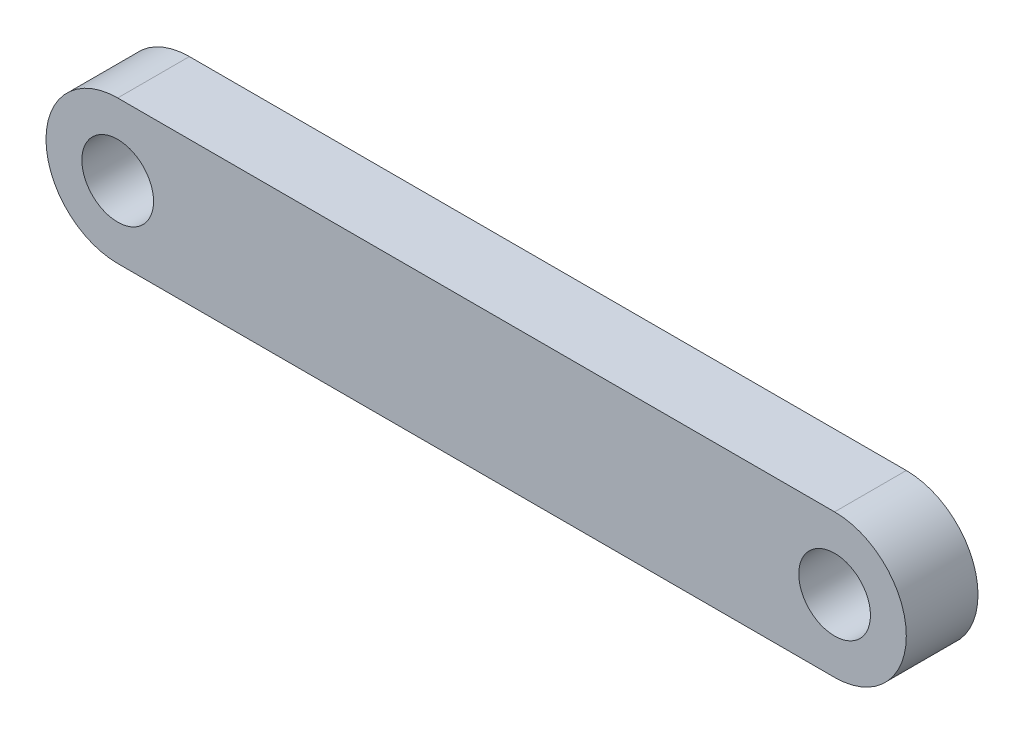
ISO-10303-21;
HEADER;
FILE_DESCRIPTION(('STEP AP214'),'2;1');
FILE_NAME('part.step','',(''),(''),'','','');
FILE_SCHEMA(('AUTOMOTIVE_DESIGN { 1 0 10303 214 1 1 1 1 }'));
ENDSEC;
DATA;
#1=APPLICATION_CONTEXT('core data for automotive mechanical design processes');
#2=APPLICATION_PROTOCOL_DEFINITION('international standard','automotive_design',2000,#1);
#3=PRODUCT_CONTEXT('',#1,'mechanical');
#4=PRODUCT('Part','Part','',(#3));
#5=PRODUCT_RELATED_PRODUCT_CATEGORY('part','',(#4));
#6=PRODUCT_DEFINITION_FORMATION('','',#4);
#7=PRODUCT_DEFINITION_CONTEXT('part definition',#1,'design');
#8=PRODUCT_DEFINITION('design','',#6,#7);
#9=PRODUCT_DEFINITION_SHAPE('','',#8);
#10=(LENGTH_UNIT() NAMED_UNIT(*) SI_UNIT(.MILLI.,.METRE.));
#11=(NAMED_UNIT(*) PLANE_ANGLE_UNIT() SI_UNIT($,.RADIAN.));
#12=(NAMED_UNIT(*) SI_UNIT($,.STERADIAN.) SOLID_ANGLE_UNIT());
#13=UNCERTAINTY_MEASURE_WITH_UNIT(LENGTH_MEASURE(1.E-05),#10,'distance_accuracy_value','');
#14=(GEOMETRIC_REPRESENTATION_CONTEXT(3) GLOBAL_UNCERTAINTY_ASSIGNED_CONTEXT((#13)) GLOBAL_UNIT_ASSIGNED_CONTEXT((#10,
#11,#12)) REPRESENTATION_CONTEXT('',''));
#15=CARTESIAN_POINT('',(0.,0.,0.));
#16=DIRECTION('',(0.,0.,1.));
#17=DIRECTION('',(1.,0.,0.));
#18=AXIS2_PLACEMENT_3D('',#15,#16,#17);
#19=CARTESIAN_POINT('',(0.,0.,10.));
#20=DIRECTION('',(0.,0.,1.));
#21=DIRECTION('',(1.,0.,0.));
#22=AXIS2_PLACEMENT_3D('',#19,#20,#21);
#23=PLANE('',#22);
#24=CARTESIAN_POINT('',(0.,0.,10.));
#25=DIRECTION('',(0.,0.,1.));
#26=DIRECTION('',(1.,0.,0.));
#27=AXIS2_PLACEMENT_3D('',#24,#25,#26);
#28=CIRCLE('',#27,5.);
#29=CARTESIAN_POINT('',(5.,0.,10.));
#30=VERTEX_POINT('',#29);
#31=EDGE_CURVE('E100',#30,#30,#28,.T.);
#32=ORIENTED_EDGE('',*,*,#31,.F.);
#33=EDGE_LOOP('',(#32));
#34=FACE_BOUND('',#33,.T.);
#35=CARTESIAN_POINT('',(0.,0.,10.));
#36=DIRECTION('',(0.,0.,1.));
#37=DIRECTION('',(1.,0.,0.));
#38=AXIS2_PLACEMENT_3D('',#35,#36,#37);
#39=CIRCLE('',#38,10.);
#40=CARTESIAN_POINT('',(0.,10.,10.));
#41=VERTEX_POINT('',#40);
#42=CARTESIAN_POINT('',(0.,-10.,10.));
#43=VERTEX_POINT('',#42);
#44=EDGE_CURVE('E85',#41,#43,#39,.T.);
#45=ORIENTED_EDGE('',*,*,#44,.T.);
#46=DIRECTION('',(1.,0.,0.));
#47=VECTOR('',#46,1.);
#48=CARTESIAN_POINT('',(0.,-10.,10.));
#49=LINE('',#48,#47);
#50=CARTESIAN_POINT('',(100.,-10.,10.));
#51=VERTEX_POINT('',#50);
#52=EDGE_CURVE('E80',#43,#51,#49,.T.);
#53=ORIENTED_EDGE('',*,*,#52,.T.);
#54=CARTESIAN_POINT('',(100.,0.,10.));
#55=DIRECTION('',(0.,0.,1.));
#56=DIRECTION('',(1.,0.,0.));
#57=AXIS2_PLACEMENT_3D('',#54,#55,#56);
#58=CIRCLE('',#57,10.);
#59=CARTESIAN_POINT('',(100.,10.,10.));
#60=VERTEX_POINT('',#59);
#61=EDGE_CURVE('E83',#51,#60,#58,.T.);
#62=ORIENTED_EDGE('',*,*,#61,.T.);
#63=DIRECTION('',(-1.,0.,0.));
#64=VECTOR('',#63,1.);
#65=CARTESIAN_POINT('',(0.,10.,10.));
#66=LINE('',#65,#64);
#67=EDGE_CURVE('E50',#60,#41,#66,.T.);
#68=ORIENTED_EDGE('',*,*,#67,.T.);
#69=EDGE_LOOP('',(#45,#53,#62,#68));
#70=FACE_BOUND('',#69,.T.);
#71=CARTESIAN_POINT('',(100.,0.,10.));
#72=DIRECTION('',(0.,0.,1.));
#73=DIRECTION('',(1.,0.,0.));
#74=AXIS2_PLACEMENT_3D('',#71,#72,#73);
#75=CIRCLE('',#74,5.);
#76=CARTESIAN_POINT('',(105.,0.,10.));
#77=VERTEX_POINT('',#76);
#78=EDGE_CURVE('E115',#77,#77,#75,.T.);
#79=ORIENTED_EDGE('',*,*,#78,.F.);
#80=EDGE_LOOP('',(#79));
#81=FACE_BOUND('',#80,.T.);
#82=ADVANCED_FACE('F33',(#34,#70,#81),#23,.T.);
#83=CARTESIAN_POINT('',(0.,0.,0.));
#84=DIRECTION('',(0.,0.,1.));
#85=DIRECTION('',(1.,0.,0.));
#86=AXIS2_PLACEMENT_3D('',#83,#84,#85);
#87=PLANE('',#86);
#88=CARTESIAN_POINT('',(0.,0.,0.));
#89=DIRECTION('',(0.,0.,1.));
#90=DIRECTION('',(1.,0.,0.));
#91=AXIS2_PLACEMENT_3D('',#88,#89,#90);
#92=CIRCLE('',#91,5.);
#93=CARTESIAN_POINT('',(5.,0.,0.));
#94=VERTEX_POINT('',#93);
#95=EDGE_CURVE('E112',#94,#94,#92,.T.);
#96=ORIENTED_EDGE('',*,*,#95,.T.);
#97=EDGE_LOOP('',(#96));
#98=FACE_BOUND('',#97,.T.);
#99=CARTESIAN_POINT('',(0.,0.,0.));
#100=DIRECTION('',(0.,0.,1.));
#101=DIRECTION('',(1.,0.,0.));
#102=AXIS2_PLACEMENT_3D('',#99,#100,#101);
#103=CIRCLE('',#102,10.);
#104=CARTESIAN_POINT('',(0.,10.,0.));
#105=VERTEX_POINT('',#104);
#106=CARTESIAN_POINT('',(0.,-10.,0.));
#107=VERTEX_POINT('',#106);
#108=EDGE_CURVE('E97',#105,#107,#103,.T.);
#109=ORIENTED_EDGE('',*,*,#108,.F.);
#110=DIRECTION('',(-1.,0.,0.));
#111=VECTOR('',#110,1.);
#112=CARTESIAN_POINT('',(0.,10.,0.));
#113=LINE('',#112,#111);
#114=CARTESIAN_POINT('',(100.,10.,0.));
#115=VERTEX_POINT('',#114);
#116=EDGE_CURVE('E73',#115,#105,#113,.T.);
#117=ORIENTED_EDGE('',*,*,#116,.F.);
#118=CARTESIAN_POINT('',(100.,0.,0.));
#119=DIRECTION('',(0.,0.,1.));
#120=DIRECTION('',(1.,0.,0.));
#121=AXIS2_PLACEMENT_3D('',#118,#119,#120);
#122=CIRCLE('',#121,10.);
#123=CARTESIAN_POINT('',(100.,-10.,0.));
#124=VERTEX_POINT('',#123);
#125=EDGE_CURVE('E67',#124,#115,#122,.T.);
#126=ORIENTED_EDGE('',*,*,#125,.F.);
#127=DIRECTION('',(1.,0.,0.));
#128=VECTOR('',#127,1.);
#129=CARTESIAN_POINT('',(0.,-10.,0.));
#130=LINE('',#129,#128);
#131=EDGE_CURVE('E89',#107,#124,#130,.T.);
#132=ORIENTED_EDGE('',*,*,#131,.F.);
#133=EDGE_LOOP('',(#109,#117,#126,#132));
#134=FACE_BOUND('',#133,.T.);
#135=CARTESIAN_POINT('',(100.,0.,0.));
#136=DIRECTION('',(0.,0.,1.));
#137=DIRECTION('',(1.,0.,0.));
#138=AXIS2_PLACEMENT_3D('',#135,#136,#137);
#139=CIRCLE('',#138,5.);
#140=CARTESIAN_POINT('',(105.,0.,0.));
#141=VERTEX_POINT('',#140);
#142=EDGE_CURVE('E118',#141,#141,#139,.T.);
#143=ORIENTED_EDGE('',*,*,#142,.T.);
#144=EDGE_LOOP('',(#143));
#145=FACE_BOUND('',#144,.T.);
#146=ADVANCED_FACE('F108',(#98,#134,#145),#87,.F.);
#147=CARTESIAN_POINT('',(0.,0.,10.));
#148=DIRECTION('',(0.,0.,-1.));
#149=DIRECTION('',(-1.,0.,0.));
#150=AXIS2_PLACEMENT_3D('',#147,#148,#149);
#151=CYLINDRICAL_SURFACE('',#150,10.);
#152=ORIENTED_EDGE('',*,*,#108,.T.);
#153=DIRECTION('',(0.,0.,-1.));
#154=VECTOR('',#153,1.);
#155=CARTESIAN_POINT('',(0.,-10.,10.));
#156=LINE('',#155,#154);
#157=EDGE_CURVE('E11',#43,#107,#156,.T.);
#158=ORIENTED_EDGE('',*,*,#157,.F.);
#159=ORIENTED_EDGE('',*,*,#44,.F.);
#160=DIRECTION('',(0.,0.,-1.));
#161=VECTOR('',#160,1.);
#162=CARTESIAN_POINT('',(0.,10.,10.));
#163=LINE('',#162,#161);
#164=EDGE_CURVE('E93',#41,#105,#163,.T.);
#165=ORIENTED_EDGE('',*,*,#164,.T.);
#166=EDGE_LOOP('',(#152,#158,#159,#165));
#167=FACE_BOUND('',#166,.T.);
#168=ADVANCED_FACE('F35',(#167),#151,.T.);
#169=CARTESIAN_POINT('',(0.,-10.,10.));
#170=DIRECTION('',(0.,1.,0.));
#171=DIRECTION('',(-1.,0.,0.));
#172=AXIS2_PLACEMENT_3D('',#169,#170,#171);
#173=PLANE('',#172);
#174=ORIENTED_EDGE('',*,*,#131,.T.);
#175=DIRECTION('',(0.,0.,-1.));
#176=VECTOR('',#175,1.);
#177=CARTESIAN_POINT('',(100.,-10.,10.));
#178=LINE('',#177,#176);
#179=EDGE_CURVE('E42',#51,#124,#178,.T.);
#180=ORIENTED_EDGE('',*,*,#179,.F.);
#181=ORIENTED_EDGE('',*,*,#52,.F.);
#182=ORIENTED_EDGE('',*,*,#157,.T.);
#183=EDGE_LOOP('',(#174,#180,#181,#182));
#184=FACE_BOUND('',#183,.T.);
#185=ADVANCED_FACE('F88',(#184),#173,.F.);
#186=CARTESIAN_POINT('',(100.,0.,10.));
#187=DIRECTION('',(0.,0.,-1.));
#188=DIRECTION('',(-1.,0.,0.));
#189=AXIS2_PLACEMENT_3D('',#186,#187,#188);
#190=CYLINDRICAL_SURFACE('',#189,10.);
#191=ORIENTED_EDGE('',*,*,#125,.T.);
#192=DIRECTION('',(0.,0.,-1.));
#193=VECTOR('',#192,1.);
#194=CARTESIAN_POINT('',(100.,10.,10.));
#195=LINE('',#194,#193);
#196=EDGE_CURVE('E90',#60,#115,#195,.T.);
#197=ORIENTED_EDGE('',*,*,#196,.F.);
#198=ORIENTED_EDGE('',*,*,#61,.F.);
#199=ORIENTED_EDGE('',*,*,#179,.T.);
#200=EDGE_LOOP('',(#191,#197,#198,#199));
#201=FACE_BOUND('',#200,.T.);
#202=ADVANCED_FACE('F91',(#201),#190,.T.);
#203=CARTESIAN_POINT('',(0.,10.,10.));
#204=DIRECTION('',(0.,-1.,0.));
#205=DIRECTION('',(1.,0.,0.));
#206=AXIS2_PLACEMENT_3D('',#203,#204,#205);
#207=PLANE('',#206);
#208=ORIENTED_EDGE('',*,*,#116,.T.);
#209=ORIENTED_EDGE('',*,*,#164,.F.);
#210=ORIENTED_EDGE('',*,*,#67,.F.);
#211=ORIENTED_EDGE('',*,*,#196,.T.);
#212=EDGE_LOOP('',(#208,#209,#210,#211));
#213=FACE_BOUND('',#212,.T.);
#214=ADVANCED_FACE('F105',(#213),#207,.F.);
#215=CARTESIAN_POINT('',(0.,0.,10.));
#216=DIRECTION('',(0.,0.,-1.));
#217=DIRECTION('',(-1.,0.,0.));
#218=AXIS2_PLACEMENT_3D('',#215,#216,#217);
#219=CYLINDRICAL_SURFACE('',#218,5.);
#220=ORIENTED_EDGE('',*,*,#31,.T.);
#221=EDGE_LOOP('',(#220));
#222=FACE_BOUND('',#221,.T.);
#223=ORIENTED_EDGE('',*,*,#95,.F.);
#224=EDGE_LOOP('',(#223));
#225=FACE_BOUND('',#224,.T.);
#226=ADVANCED_FACE('F136',(#222,#225),#219,.F.);
#227=CARTESIAN_POINT('',(100.,0.,10.));
#228=DIRECTION('',(0.,0.,-1.));
#229=DIRECTION('',(-1.,0.,0.));
#230=AXIS2_PLACEMENT_3D('',#227,#228,#229);
#231=CYLINDRICAL_SURFACE('',#230,5.);
#232=ORIENTED_EDGE('',*,*,#78,.T.);
#233=EDGE_LOOP('',(#232));
#234=FACE_BOUND('',#233,.T.);
#235=ORIENTED_EDGE('',*,*,#142,.F.);
#236=EDGE_LOOP('',(#235));
#237=FACE_BOUND('',#236,.T.);
#238=ADVANCED_FACE('F124',(#234,#237),#231,.F.);
#239=CLOSED_SHELL('',(#82,#146,#168,#185,#202,#214,#226,#238));
#240=MANIFOLD_SOLID_BREP('B2',#239);
#241=ADVANCED_BREP_SHAPE_REPRESENTATION('',(#18,#240),#14);
#242=SHAPE_DEFINITION_REPRESENTATION(#9,#241);
ENDSEC;
END-ISO-10303-21;
